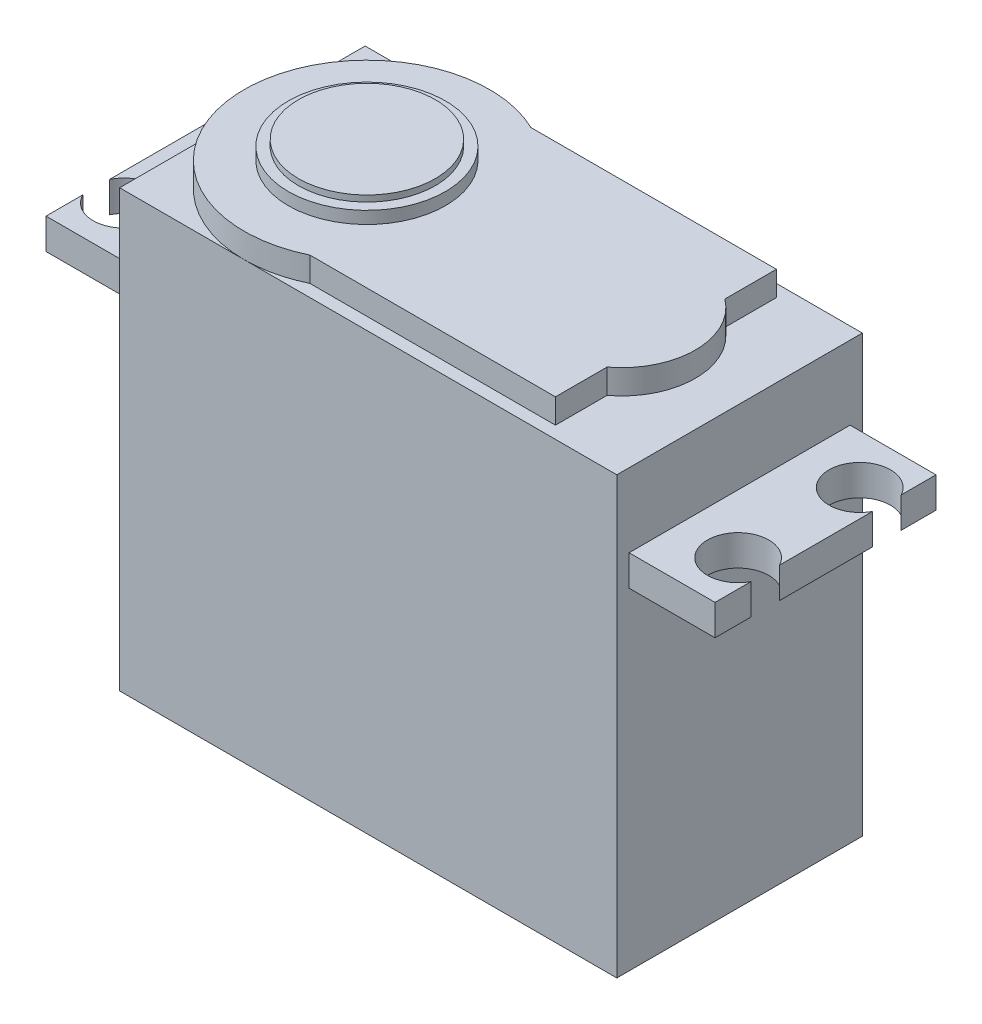
ISO-10303-21;
HEADER;
FILE_DESCRIPTION(('STEP AP214'),'2;1');
FILE_NAME('part.step','',(''),(''),'','','');
FILE_SCHEMA(('AUTOMOTIVE_DESIGN { 1 0 10303 214 1 1 1 1 }'));
ENDSEC;
DATA;
#1=APPLICATION_CONTEXT('core data for automotive mechanical design processes');
#2=APPLICATION_PROTOCOL_DEFINITION('international standard','automotive_design',2000,#1);
#3=PRODUCT_CONTEXT('',#1,'mechanical');
#4=PRODUCT('Part','Part','',(#3));
#5=PRODUCT_RELATED_PRODUCT_CATEGORY('part','',(#4));
#6=PRODUCT_DEFINITION_FORMATION('','',#4);
#7=PRODUCT_DEFINITION_CONTEXT('part definition',#1,'design');
#8=PRODUCT_DEFINITION('design','',#6,#7);
#9=PRODUCT_DEFINITION_SHAPE('','',#8);
#10=(LENGTH_UNIT() NAMED_UNIT(*) SI_UNIT(.MILLI.,.METRE.));
#11=(NAMED_UNIT(*) PLANE_ANGLE_UNIT() SI_UNIT($,.RADIAN.));
#12=(NAMED_UNIT(*) SI_UNIT($,.STERADIAN.) SOLID_ANGLE_UNIT());
#13=UNCERTAINTY_MEASURE_WITH_UNIT(LENGTH_MEASURE(1.E-05),#10,'distance_accuracy_value','');
#14=(GEOMETRIC_REPRESENTATION_CONTEXT(3) GLOBAL_UNCERTAINTY_ASSIGNED_CONTEXT((#13)) GLOBAL_UNIT_ASSIGNED_CONTEXT((#10,
#11,#12)) REPRESENTATION_CONTEXT('',''));
#15=CARTESIAN_POINT('',(0.,0.,0.));
#16=DIRECTION('',(0.,0.,1.));
#17=DIRECTION('',(1.,0.,0.));
#18=AXIS2_PLACEMENT_3D('',#15,#16,#17);
#19=CARTESIAN_POINT('',(27.25,27.,-6.25));
#20=DIRECTION('',(1.,0.,0.));
#21=DIRECTION('',(0.,0.,-1.));
#22=AXIS2_PLACEMENT_3D('',#19,#20,#21);
#23=PLANE('',#22);
#24=DIRECTION('',(0.,1.,0.));
#25=VECTOR('',#24,1.);
#26=CARTESIAN_POINT('',(27.25,26.96,3.74107253444669));
#27=LINE('',#26,#25);
#28=CARTESIAN_POINT('',(27.25,27.,3.74107253444669));
#29=VERTEX_POINT('',#28);
#30=CARTESIAN_POINT('',(27.25,29.5,3.74107253444668));
#31=VERTEX_POINT('',#30);
#32=EDGE_CURVE('E50',#29,#31,#27,.T.);
#33=ORIENTED_EDGE('',*,*,#32,.F.);
#34=DIRECTION('',(0.,0.,-1.));
#35=VECTOR('',#34,1.);
#36=CARTESIAN_POINT('',(27.25,27.,-6.25));
#37=LINE('',#36,#35);
#38=CARTESIAN_POINT('',(27.25,27.,-3.83507253444689));
#39=VERTEX_POINT('',#38);
#40=EDGE_CURVE('E254',#29,#39,#37,.T.);
#41=ORIENTED_EDGE('',*,*,#40,.T.);
#42=DIRECTION('',(0.,1.,0.));
#43=VECTOR('',#42,1.);
#44=CARTESIAN_POINT('',(27.25,26.96,-3.83507253444689));
#45=LINE('',#44,#43);
#46=CARTESIAN_POINT('',(27.25,29.5,-3.83507253444689));
#47=VERTEX_POINT('',#46);
#48=EDGE_CURVE('E319',#39,#47,#45,.T.);
#49=ORIENTED_EDGE('',*,*,#48,.T.);
#50=DIRECTION('',(0.,0.,-1.));
#51=VECTOR('',#50,1.);
#52=CARTESIAN_POINT('',(27.25,29.5,0.));
#53=LINE('',#52,#51);
#54=EDGE_CURVE('E234',#31,#47,#53,.T.);
#55=ORIENTED_EDGE('',*,*,#54,.F.);
#56=EDGE_LOOP('',(#33,#41,#49,#55));
#57=FACE_BOUND('',#56,.T.);
#58=ADVANCED_FACE('F35',(#57),#23,.T.);
#59=DIRECTION('',(0.,1.,0.));
#60=VECTOR('',#59,1.);
#61=CARTESIAN_POINT('',(27.25,26.96,-6.1649274655531));
#62=LINE('',#61,#60);
#63=CARTESIAN_POINT('',(27.25,27.,-6.1649274655531));
#64=VERTEX_POINT('',#63);
#65=CARTESIAN_POINT('',(27.25,29.5,-6.1649274655531));
#66=VERTEX_POINT('',#65);
#67=EDGE_CURVE('E58',#64,#66,#62,.T.);
#68=ORIENTED_EDGE('',*,*,#67,.F.);
#69=CARTESIAN_POINT('',(27.25,27.,-9.));
#70=VERTEX_POINT('',#69);
#71=EDGE_CURVE('E255',#64,#70,#37,.T.);
#72=ORIENTED_EDGE('',*,*,#71,.T.);
#73=DIRECTION('',(0.,1.,0.));
#74=VECTOR('',#73,1.);
#75=CARTESIAN_POINT('',(27.25,27.,-9.));
#76=LINE('',#75,#74);
#77=CARTESIAN_POINT('',(27.25,29.5,-9.));
#78=VERTEX_POINT('',#77);
#79=EDGE_CURVE('E252',#70,#78,#76,.T.);
#80=ORIENTED_EDGE('',*,*,#79,.T.);
#81=EDGE_CURVE('E236',#66,#78,#53,.T.);
#82=ORIENTED_EDGE('',*,*,#81,.F.);
#83=EDGE_LOOP('',(#68,#72,#80,#82));
#84=FACE_BOUND('',#83,.T.);
#85=ADVANCED_FACE('F336',(#84),#23,.T.);
#86=CARTESIAN_POINT('',(-27.25,27.,0.));
#87=DIRECTION('',(1.,0.,0.));
#88=DIRECTION('',(0.,0.,-1.));
#89=AXIS2_PLACEMENT_3D('',#86,#87,#88);
#90=PLANE('',#89);
#91=DIRECTION('',(0.,0.,-1.));
#92=VECTOR('',#91,1.);
#93=CARTESIAN_POINT('',(-27.25,27.,0.));
#94=LINE('',#93,#92);
#95=CARTESIAN_POINT('',(-27.25,27.,3.81627526411505));
#96=VERTEX_POINT('',#95);
#97=CARTESIAN_POINT('',(-27.25,27.,-3.91027526411485));
#98=VERTEX_POINT('',#97);
#99=EDGE_CURVE('E273',#96,#98,#94,.T.);
#100=ORIENTED_EDGE('',*,*,#99,.F.);
#101=DIRECTION('',(0.,1.,0.));
#102=VECTOR('',#101,1.);
#103=CARTESIAN_POINT('',(-27.25,26.96,3.81627526411505));
#104=LINE('',#103,#102);
#105=CARTESIAN_POINT('',(-27.25,29.5,3.81627526411505));
#106=VERTEX_POINT('',#105);
#107=EDGE_CURVE('E307',#96,#106,#104,.T.);
#108=ORIENTED_EDGE('',*,*,#107,.T.);
#109=DIRECTION('',(0.,0.,-1.));
#110=VECTOR('',#109,1.);
#111=CARTESIAN_POINT('',(-27.25,29.5,0.));
#112=LINE('',#111,#110);
#113=CARTESIAN_POINT('',(-27.25,29.5,-3.91027526411485));
#114=VERTEX_POINT('',#113);
#115=EDGE_CURVE('E264',#106,#114,#112,.T.);
#116=ORIENTED_EDGE('',*,*,#115,.T.);
#117=DIRECTION('',(0.,1.,0.));
#118=VECTOR('',#117,1.);
#119=CARTESIAN_POINT('',(-27.25,26.96,-3.91027526411484));
#120=LINE('',#119,#118);
#121=EDGE_CURVE('E301',#114,#98,#120,.F.);
#122=ORIENTED_EDGE('',*,*,#121,.T.);
#123=EDGE_LOOP('',(#100,#108,#116,#122));
#124=FACE_BOUND('',#123,.T.);
#125=ADVANCED_FACE('F490',(#124),#90,.F.);
#126=CARTESIAN_POINT('',(-27.25,27.,-6.08972473588515));
#127=VERTEX_POINT('',#126);
#128=CARTESIAN_POINT('',(-27.25,27.,-9.));
#129=VERTEX_POINT('',#128);
#130=EDGE_CURVE('E274',#127,#129,#94,.T.);
#131=ORIENTED_EDGE('',*,*,#130,.F.);
#132=DIRECTION('',(0.,1.,0.));
#133=VECTOR('',#132,1.);
#134=CARTESIAN_POINT('',(-27.25,26.96,-6.08972473588515));
#135=LINE('',#134,#133);
#136=CARTESIAN_POINT('',(-27.25,29.5,-6.08972473588515));
#137=VERTEX_POINT('',#136);
#138=EDGE_CURVE('E296',#127,#137,#135,.T.);
#139=ORIENTED_EDGE('',*,*,#138,.T.);
#140=CARTESIAN_POINT('',(-27.25,29.5,-9.));
#141=VERTEX_POINT('',#140);
#142=EDGE_CURVE('E265',#137,#141,#112,.T.);
#143=ORIENTED_EDGE('',*,*,#142,.T.);
#144=DIRECTION('',(0.,1.,0.));
#145=VECTOR('',#144,1.);
#146=CARTESIAN_POINT('',(-27.25,27.,-9.));
#147=LINE('',#146,#145);
#148=EDGE_CURVE('E243',#129,#141,#147,.T.);
#149=ORIENTED_EDGE('',*,*,#148,.F.);
#150=EDGE_LOOP('',(#131,#139,#143,#149));
#151=FACE_BOUND('',#150,.T.);
#152=ADVANCED_FACE('F518',(#151),#90,.F.);
#153=CARTESIAN_POINT('',(-20.25,35.5,10.));
#154=DIRECTION('',(1.,0.,0.));
#155=DIRECTION('',(0.,0.,-1.));
#156=AXIS2_PLACEMENT_3D('',#153,#154,#155);
#157=PLANE('',#156);
#158=DIRECTION('',(0.,0.,1.));
#159=VECTOR('',#158,1.);
#160=CARTESIAN_POINT('',(-20.25,0.,10.));
#161=LINE('',#160,#159);
#162=CARTESIAN_POINT('',(-20.25,0.,-10.));
#163=VERTEX_POINT('',#162);
#164=CARTESIAN_POINT('',(-20.25,0.,10.));
#165=VERTEX_POINT('',#164);
#166=EDGE_CURVE('E409',#163,#165,#161,.T.);
#167=ORIENTED_EDGE('',*,*,#166,.T.);
#168=DIRECTION('',(0.,-1.,0.));
#169=VECTOR('',#168,1.);
#170=CARTESIAN_POINT('',(-20.25,35.5,10.));
#171=LINE('',#170,#169);
#172=CARTESIAN_POINT('',(-20.25,35.5,10.));
#173=VERTEX_POINT('',#172);
#174=EDGE_CURVE('E440',#173,#165,#171,.T.);
#175=ORIENTED_EDGE('',*,*,#174,.F.);
#176=DIRECTION('',(0.,0.,1.));
#177=VECTOR('',#176,1.);
#178=CARTESIAN_POINT('',(-20.25,35.5,10.));
#179=LINE('',#178,#177);
#180=CARTESIAN_POINT('',(-20.25,35.5,-10.));
#181=VERTEX_POINT('',#180);
#182=EDGE_CURVE('E410',#181,#173,#179,.T.);
#183=ORIENTED_EDGE('',*,*,#182,.F.);
#184=DIRECTION('',(0.,-1.,0.));
#185=VECTOR('',#184,1.);
#186=CARTESIAN_POINT('',(-20.25,35.5,-10.));
#187=LINE('',#186,#185);
#188=EDGE_CURVE('E424',#181,#163,#187,.T.);
#189=ORIENTED_EDGE('',*,*,#188,.T.);
#190=EDGE_LOOP('',(#167,#175,#183,#189));
#191=FACE_BOUND('',#190,.T.);
#192=DIRECTION('',(0.,1.,0.));
#193=VECTOR('',#192,1.);
#194=CARTESIAN_POINT('',(-20.25,27.,9.));
#195=LINE('',#194,#193);
#196=CARTESIAN_POINT('',(-20.25,27.,9.));
#197=VERTEX_POINT('',#196);
#198=CARTESIAN_POINT('',(-20.25,29.5,9.));
#199=VERTEX_POINT('',#198);
#200=EDGE_CURVE('E284',#197,#199,#195,.T.);
#201=ORIENTED_EDGE('',*,*,#200,.F.);
#202=DIRECTION('',(0.,0.,1.));
#203=VECTOR('',#202,1.);
#204=CARTESIAN_POINT('',(-20.25,27.,0.));
#205=LINE('',#204,#203);
#206=CARTESIAN_POINT('',(-20.25,27.,-9.));
#207=VERTEX_POINT('',#206);
#208=EDGE_CURVE('E263',#207,#197,#205,.T.);
#209=ORIENTED_EDGE('',*,*,#208,.F.);
#210=DIRECTION('',(0.,1.,0.));
#211=VECTOR('',#210,1.);
#212=CARTESIAN_POINT('',(-20.25,27.,-9.));
#213=LINE('',#212,#211);
#214=CARTESIAN_POINT('',(-20.25,29.5,-9.));
#215=VERTEX_POINT('',#214);
#216=EDGE_CURVE('E246',#207,#215,#213,.T.);
#217=ORIENTED_EDGE('',*,*,#216,.T.);
#218=DIRECTION('',(0.,0.,1.));
#219=VECTOR('',#218,1.);
#220=CARTESIAN_POINT('',(-20.25,29.5,0.));
#221=LINE('',#220,#219);
#222=EDGE_CURVE('E268',#215,#199,#221,.T.);
#223=ORIENTED_EDGE('',*,*,#222,.T.);
#224=EDGE_LOOP('',(#201,#209,#217,#223));
#225=FACE_BOUND('',#224,.T.);
#226=ADVANCED_FACE('F37',(#191,#225),#157,.F.);
#227=CARTESIAN_POINT('',(20.25,35.5,10.));
#228=DIRECTION('',(-1.,0.,0.));
#229=DIRECTION('',(0.,0.,1.));
#230=AXIS2_PLACEMENT_3D('',#227,#228,#229);
#231=PLANE('',#230);
#232=DIRECTION('',(0.,0.,-1.));
#233=VECTOR('',#232,1.);
#234=CARTESIAN_POINT('',(20.25,0.,10.));
#235=LINE('',#234,#233);
#236=CARTESIAN_POINT('',(20.25,0.,10.));
#237=VERTEX_POINT('',#236);
#238=CARTESIAN_POINT('',(20.25,0.,-10.));
#239=VERTEX_POINT('',#238);
#240=EDGE_CURVE('E429',#237,#239,#235,.T.);
#241=ORIENTED_EDGE('',*,*,#240,.T.);
#242=DIRECTION('',(0.,-1.,0.));
#243=VECTOR('',#242,1.);
#244=CARTESIAN_POINT('',(20.25,35.5,-10.));
#245=LINE('',#244,#243);
#246=CARTESIAN_POINT('',(20.25,35.5,-10.));
#247=VERTEX_POINT('',#246);
#248=EDGE_CURVE('E434',#247,#239,#245,.T.);
#249=ORIENTED_EDGE('',*,*,#248,.F.);
#250=DIRECTION('',(0.,0.,-1.));
#251=VECTOR('',#250,1.);
#252=CARTESIAN_POINT('',(20.25,35.5,10.));
#253=LINE('',#252,#251);
#254=CARTESIAN_POINT('',(20.25,35.5,10.));
#255=VERTEX_POINT('',#254);
#256=EDGE_CURVE('E418',#255,#247,#253,.T.);
#257=ORIENTED_EDGE('',*,*,#256,.F.);
#258=DIRECTION('',(0.,-1.,0.));
#259=VECTOR('',#258,1.);
#260=CARTESIAN_POINT('',(20.25,35.5,10.));
#261=LINE('',#260,#259);
#262=EDGE_CURVE('E437',#255,#237,#261,.T.);
#263=ORIENTED_EDGE('',*,*,#262,.T.);
#264=EDGE_LOOP('',(#241,#249,#257,#263));
#265=FACE_BOUND('',#264,.T.);
#266=DIRECTION('',(0.,0.,1.));
#267=VECTOR('',#266,1.);
#268=CARTESIAN_POINT('',(20.25,27.,0.));
#269=LINE('',#268,#267);
#270=CARTESIAN_POINT('',(20.25,27.,-9.));
#271=VERTEX_POINT('',#270);
#272=CARTESIAN_POINT('',(20.25,27.,9.));
#273=VERTEX_POINT('',#272);
#274=EDGE_CURVE('E237',#271,#273,#269,.T.);
#275=ORIENTED_EDGE('',*,*,#274,.T.);
#276=DIRECTION('',(0.,1.,0.));
#277=VECTOR('',#276,1.);
#278=CARTESIAN_POINT('',(20.25,27.,9.));
#279=LINE('',#278,#277);
#280=CARTESIAN_POINT('',(20.25,29.5,9.));
#281=VERTEX_POINT('',#280);
#282=EDGE_CURVE('E278',#273,#281,#279,.T.);
#283=ORIENTED_EDGE('',*,*,#282,.T.);
#284=DIRECTION('',(0.,0.,1.));
#285=VECTOR('',#284,1.);
#286=CARTESIAN_POINT('',(20.25,29.5,0.));
#287=LINE('',#286,#285);
#288=CARTESIAN_POINT('',(20.25,29.5,-9.));
#289=VERTEX_POINT('',#288);
#290=EDGE_CURVE('E240',#289,#281,#287,.T.);
#291=ORIENTED_EDGE('',*,*,#290,.F.);
#292=DIRECTION('',(0.,1.,0.));
#293=VECTOR('',#292,1.);
#294=CARTESIAN_POINT('',(20.25,27.,-9.));
#295=LINE('',#294,#293);
#296=EDGE_CURVE('E342',#271,#289,#295,.T.);
#297=ORIENTED_EDGE('',*,*,#296,.F.);
#298=EDGE_LOOP('',(#275,#283,#291,#297));
#299=FACE_BOUND('',#298,.T.);
#300=ADVANCED_FACE('F704',(#265,#299),#231,.F.);
#301=CARTESIAN_POINT('',(-10.1088989435407,38.5,0.));
#302=DIRECTION('',(0.,1.,0.));
#303=DIRECTION('',(0.,0.,1.));
#304=AXIS2_PLACEMENT_3D('',#301,#302,#303);
#305=PLANE('',#304);
#306=CARTESIAN_POINT('',(-10.1088989435407,38.5,0.));
#307=DIRECTION('',(0.,1.,0.));
#308=DIRECTION('',(0.,0.,1.));
#309=AXIS2_PLACEMENT_3D('',#306,#307,#308);
#310=CIRCLE('',#309,6.4);
#311=CARTESIAN_POINT('',(-10.1088989435407,38.5,6.40000000000001));
#312=VERTEX_POINT('',#311);
#313=EDGE_CURVE('E353',#312,#312,#310,.T.);
#314=ORIENTED_EDGE('',*,*,#313,.T.);
#315=EDGE_LOOP('',(#314));
#316=FACE_BOUND('',#315,.T.);
#317=CARTESIAN_POINT('',(-10.1088989435407,38.5,0.));
#318=DIRECTION('',(0.,1.,0.));
#319=DIRECTION('',(0.,0.,1.));
#320=AXIS2_PLACEMENT_3D('',#317,#318,#319);
#321=CIRCLE('',#320,5.575);
#322=CARTESIAN_POINT('',(-10.1088989435407,38.5,5.57500000000001));
#323=VERTEX_POINT('',#322);
#324=EDGE_CURVE('E344',#323,#323,#321,.T.);
#325=ORIENTED_EDGE('',*,*,#324,.F.);
#326=EDGE_LOOP('',(#325));
#327=FACE_BOUND('',#326,.T.);
#328=ADVANCED_FACE('F688',(#316,#327),#305,.T.);
#329=CARTESIAN_POINT('',(-10.1088989435407,37.5,0.));
#330=DIRECTION('',(0.,1.,0.));
#331=DIRECTION('',(0.,0.,1.));
#332=AXIS2_PLACEMENT_3D('',#329,#330,#331);
#333=PLANE('',#332);
#334=CARTESIAN_POINT('',(-10.1088989435407,37.5,0.));
#335=DIRECTION('',(0.,1.,0.));
#336=DIRECTION('',(0.,0.,1.));
#337=AXIS2_PLACEMENT_3D('',#334,#335,#336);
#338=CIRCLE('',#337,10.);
#339=CARTESIAN_POINT('',(-5.75,37.5,-9.));
#340=VERTEX_POINT('',#339);
#341=CARTESIAN_POINT('',(-5.75,37.5,9.));
#342=VERTEX_POINT('',#341);
#343=EDGE_CURVE('E359',#340,#342,#338,.T.);
#344=ORIENTED_EDGE('',*,*,#343,.T.);
#345=DIRECTION('',(1.,0.,0.));
#346=VECTOR('',#345,1.);
#347=CARTESIAN_POINT('',(-5.75,37.5,9.));
#348=LINE('',#347,#346);
#349=CARTESIAN_POINT('',(14.25,37.5,9.));
#350=VERTEX_POINT('',#349);
#351=EDGE_CURVE('E362',#342,#350,#348,.T.);
#352=ORIENTED_EDGE('',*,*,#351,.T.);
#353=DIRECTION('',(0.,0.,-1.));
#354=VECTOR('',#353,1.);
#355=CARTESIAN_POINT('',(14.25,37.5,9.));
#356=LINE('',#355,#354);
#357=CARTESIAN_POINT('',(14.25,37.5,4.8));
#358=VERTEX_POINT('',#357);
#359=EDGE_CURVE('E365',#350,#358,#356,.T.);
#360=ORIENTED_EDGE('',*,*,#359,.T.);
#361=CARTESIAN_POINT('',(10.65,37.5,0.));
#362=DIRECTION('',(0.,1.,0.));
#363=DIRECTION('',(0.,0.,-1.));
#364=AXIS2_PLACEMENT_3D('',#361,#362,#363);
#365=CIRCLE('',#364,6.);
#366=CARTESIAN_POINT('',(14.25,37.5,-4.8));
#367=VERTEX_POINT('',#366);
#368=EDGE_CURVE('E367',#358,#367,#365,.T.);
#369=ORIENTED_EDGE('',*,*,#368,.T.);
#370=DIRECTION('',(0.,0.,-1.));
#371=VECTOR('',#370,1.);
#372=CARTESIAN_POINT('',(14.25,37.5,-9.));
#373=LINE('',#372,#371);
#374=CARTESIAN_POINT('',(14.25,37.5,-9.));
#375=VERTEX_POINT('',#374);
#376=EDGE_CURVE('E369',#367,#375,#373,.T.);
#377=ORIENTED_EDGE('',*,*,#376,.T.);
#378=DIRECTION('',(-1.,0.,0.));
#379=VECTOR('',#378,1.);
#380=CARTESIAN_POINT('',(-5.75,37.5,-9.));
#381=LINE('',#380,#379);
#382=EDGE_CURVE('E371',#375,#340,#381,.T.);
#383=ORIENTED_EDGE('',*,*,#382,.T.);
#384=EDGE_LOOP('',(#344,#352,#360,#369,#377,#383));
#385=FACE_BOUND('',#384,.T.);
#386=CARTESIAN_POINT('',(-10.1088989435407,37.5,0.));
#387=DIRECTION('',(0.,1.,0.));
#388=DIRECTION('',(0.,0.,1.));
#389=AXIS2_PLACEMENT_3D('',#386,#387,#388);
#390=CIRCLE('',#389,6.4);
#391=CARTESIAN_POINT('',(-10.1088989435407,37.5,6.40000000000001));
#392=VERTEX_POINT('',#391);
#393=EDGE_CURVE('E350',#392,#392,#390,.T.);
#394=ORIENTED_EDGE('',*,*,#393,.F.);
#395=EDGE_LOOP('',(#394));
#396=FACE_BOUND('',#395,.T.);
#397=ADVANCED_FACE('F458',(#385,#396),#333,.T.);
#398=CARTESIAN_POINT('',(0.,35.5,0.));
#399=DIRECTION('',(0.,-1.,0.));
#400=DIRECTION('',(0.,0.,-1.));
#401=AXIS2_PLACEMENT_3D('',#398,#399,#400);
#402=PLANE('',#401);
#403=CARTESIAN_POINT('',(-10.1088989435407,35.5,0.));
#404=DIRECTION('',(0.,1.,0.));
#405=DIRECTION('',(0.,0.,1.));
#406=AXIS2_PLACEMENT_3D('',#403,#404,#405);
#407=CIRCLE('',#406,10.);
#408=CARTESIAN_POINT('',(-5.75,35.5,-9.));
#409=VERTEX_POINT('',#408);
#410=CARTESIAN_POINT('',(-10.1088989435407,35.5,-10.));
#411=VERTEX_POINT('',#410);
#412=EDGE_CURVE('E356',#409,#411,#407,.T.);
#413=ORIENTED_EDGE('',*,*,#412,.F.);
#414=DIRECTION('',(-1.,0.,0.));
#415=VECTOR('',#414,1.);
#416=CARTESIAN_POINT('',(-5.75,35.5,-9.));
#417=LINE('',#416,#415);
#418=CARTESIAN_POINT('',(14.25,35.5,-9.));
#419=VERTEX_POINT('',#418);
#420=EDGE_CURVE('E363',#419,#409,#417,.T.);
#421=ORIENTED_EDGE('',*,*,#420,.F.);
#422=DIRECTION('',(0.,0.,-1.));
#423=VECTOR('',#422,1.);
#424=CARTESIAN_POINT('',(14.25,35.5,-9.));
#425=LINE('',#424,#423);
#426=CARTESIAN_POINT('',(14.25,35.5,-4.8));
#427=VERTEX_POINT('',#426);
#428=EDGE_CURVE('E387',#427,#419,#425,.T.);
#429=ORIENTED_EDGE('',*,*,#428,.F.);
#430=CARTESIAN_POINT('',(10.65,35.5,0.));
#431=DIRECTION('',(0.,1.,0.));
#432=DIRECTION('',(0.,0.,-1.));
#433=AXIS2_PLACEMENT_3D('',#430,#431,#432);
#434=CIRCLE('',#433,6.);
#435=CARTESIAN_POINT('',(14.25,35.5,4.8));
#436=VERTEX_POINT('',#435);
#437=EDGE_CURVE('E384',#436,#427,#434,.T.);
#438=ORIENTED_EDGE('',*,*,#437,.F.);
#439=DIRECTION('',(0.,0.,-1.));
#440=VECTOR('',#439,1.);
#441=CARTESIAN_POINT('',(14.25,35.5,9.));
#442=LINE('',#441,#440);
#443=CARTESIAN_POINT('',(14.25,35.5,9.));
#444=VERTEX_POINT('',#443);
#445=EDGE_CURVE('E381',#444,#436,#442,.T.);
#446=ORIENTED_EDGE('',*,*,#445,.F.);
#447=DIRECTION('',(1.,0.,0.));
#448=VECTOR('',#447,1.);
#449=CARTESIAN_POINT('',(-5.75,35.5,9.));
#450=LINE('',#449,#448);
#451=CARTESIAN_POINT('',(-5.75,35.5,9.));
#452=VERTEX_POINT('',#451);
#453=EDGE_CURVE('E376',#452,#444,#450,.T.);
#454=ORIENTED_EDGE('',*,*,#453,.F.);
#455=CARTESIAN_POINT('',(-10.1088989435407,35.5,10.));
#456=VERTEX_POINT('',#455);
#457=EDGE_CURVE('E378',#456,#452,#407,.T.);
#458=ORIENTED_EDGE('',*,*,#457,.F.);
#459=DIRECTION('',(1.,0.,0.));
#460=VECTOR('',#459,1.);
#461=CARTESIAN_POINT('',(-20.25,35.5,10.));
#462=LINE('',#461,#460);
#463=EDGE_CURVE('E413',#456,#255,#462,.T.);
#464=ORIENTED_EDGE('',*,*,#463,.T.);
#465=ORIENTED_EDGE('',*,*,#256,.T.);
#466=DIRECTION('',(-1.,0.,0.));
#467=VECTOR('',#466,1.);
#468=CARTESIAN_POINT('',(-20.25,35.5,-10.));
#469=LINE('',#468,#467);
#470=EDGE_CURVE('E421',#247,#411,#469,.T.);
#471=ORIENTED_EDGE('',*,*,#470,.T.);
#472=EDGE_LOOP('',(#413,#421,#429,#438,#446,#454,#458,#464,#465,#471));
#473=FACE_BOUND('',#472,.T.);
#474=ADVANCED_FACE('F465',(#473),#402,.F.);
#475=EDGE_CURVE('E377',#411,#456,#407,.T.);
#476=ORIENTED_EDGE('',*,*,#475,.F.);
#477=EDGE_CURVE('E420',#411,#181,#469,.T.);
#478=ORIENTED_EDGE('',*,*,#477,.T.);
#479=ORIENTED_EDGE('',*,*,#182,.T.);
#480=EDGE_CURVE('E415',#173,#456,#462,.T.);
#481=ORIENTED_EDGE('',*,*,#480,.T.);
#482=EDGE_LOOP('',(#476,#478,#479,#481));
#483=FACE_BOUND('',#482,.T.);
#484=ADVANCED_FACE('F626',(#483),#402,.F.);
#485=CARTESIAN_POINT('',(-20.25,35.5,10.));
#486=DIRECTION('',(0.,0.,-1.));
#487=DIRECTION('',(-1.,0.,0.));
#488=AXIS2_PLACEMENT_3D('',#485,#486,#487);
#489=PLANE('',#488);
#490=DIRECTION('',(1.,0.,0.));
#491=VECTOR('',#490,1.);
#492=CARTESIAN_POINT('',(-20.25,0.,10.));
#493=LINE('',#492,#491);
#494=EDGE_CURVE('E427',#165,#237,#493,.T.);
#495=ORIENTED_EDGE('',*,*,#494,.T.);
#496=ORIENTED_EDGE('',*,*,#262,.F.);
#497=ORIENTED_EDGE('',*,*,#463,.F.);
#498=ORIENTED_EDGE('',*,*,#480,.F.);
#499=ORIENTED_EDGE('',*,*,#174,.T.);
#500=EDGE_LOOP('',(#495,#496,#497,#498,#499));
#501=FACE_BOUND('',#500,.T.);
#502=ADVANCED_FACE('F621',(#501),#489,.F.);
#503=CARTESIAN_POINT('',(-20.25,35.5,-10.));
#504=DIRECTION('',(0.,0.,1.));
#505=DIRECTION('',(1.,0.,0.));
#506=AXIS2_PLACEMENT_3D('',#503,#504,#505);
#507=PLANE('',#506);
#508=DIRECTION('',(-1.,0.,0.));
#509=VECTOR('',#508,1.);
#510=CARTESIAN_POINT('',(-20.25,0.,-10.));
#511=LINE('',#510,#509);
#512=EDGE_CURVE('E414',#239,#163,#511,.T.);
#513=ORIENTED_EDGE('',*,*,#512,.T.);
#514=ORIENTED_EDGE('',*,*,#188,.F.);
#515=ORIENTED_EDGE('',*,*,#477,.F.);
#516=ORIENTED_EDGE('',*,*,#470,.F.);
#517=ORIENTED_EDGE('',*,*,#248,.T.);
#518=EDGE_LOOP('',(#513,#514,#515,#516,#517));
#519=FACE_BOUND('',#518,.T.);
#520=ADVANCED_FACE('F625',(#519),#507,.F.);
#521=CARTESIAN_POINT('',(0.,0.,0.));
#522=DIRECTION('',(0.,-1.,0.));
#523=DIRECTION('',(0.,0.,-1.));
#524=AXIS2_PLACEMENT_3D('',#521,#522,#523);
#525=PLANE('',#524);
#526=ORIENTED_EDGE('',*,*,#166,.F.);
#527=ORIENTED_EDGE('',*,*,#512,.F.);
#528=ORIENTED_EDGE('',*,*,#240,.F.);
#529=ORIENTED_EDGE('',*,*,#494,.F.);
#530=EDGE_LOOP('',(#526,#527,#528,#529));
#531=FACE_BOUND('',#530,.T.);
#532=ADVANCED_FACE('F635',(#531),#525,.T.);
#533=CARTESIAN_POINT('',(-10.1088989435407,37.5,0.));
#534=DIRECTION('',(0.,-1.,0.));
#535=DIRECTION('',(0.,0.,-1.));
#536=AXIS2_PLACEMENT_3D('',#533,#534,#535);
#537=CYLINDRICAL_SURFACE('',#536,10.);
#538=ORIENTED_EDGE('',*,*,#412,.T.);
#539=ORIENTED_EDGE('',*,*,#475,.T.);
#540=ORIENTED_EDGE('',*,*,#457,.T.);
#541=DIRECTION('',(0.,-1.,0.));
#542=VECTOR('',#541,1.);
#543=CARTESIAN_POINT('',(-5.75,37.5,9.));
#544=LINE('',#543,#542);
#545=EDGE_CURVE('E406',#342,#452,#544,.T.);
#546=ORIENTED_EDGE('',*,*,#545,.F.);
#547=ORIENTED_EDGE('',*,*,#343,.F.);
#548=DIRECTION('',(0.,-1.,0.));
#549=VECTOR('',#548,1.);
#550=CARTESIAN_POINT('',(-5.75,37.5,-9.));
#551=LINE('',#550,#549);
#552=EDGE_CURVE('E373',#340,#409,#551,.T.);
#553=ORIENTED_EDGE('',*,*,#552,.T.);
#554=EDGE_LOOP('',(#538,#539,#540,#546,#547,#553));
#555=FACE_BOUND('',#554,.T.);
#556=ADVANCED_FACE('F449',(#555),#537,.T.);
#557=CARTESIAN_POINT('',(-5.75,37.5,9.));
#558=DIRECTION('',(0.,0.,-1.));
#559=DIRECTION('',(-1.,0.,0.));
#560=AXIS2_PLACEMENT_3D('',#557,#558,#559);
#561=PLANE('',#560);
#562=ORIENTED_EDGE('',*,*,#453,.T.);
#563=DIRECTION('',(0.,-1.,0.));
#564=VECTOR('',#563,1.);
#565=CARTESIAN_POINT('',(14.25,37.5,9.));
#566=LINE('',#565,#564);
#567=EDGE_CURVE('E403',#350,#444,#566,.T.);
#568=ORIENTED_EDGE('',*,*,#567,.F.);
#569=ORIENTED_EDGE('',*,*,#351,.F.);
#570=ORIENTED_EDGE('',*,*,#545,.T.);
#571=EDGE_LOOP('',(#562,#568,#569,#570));
#572=FACE_BOUND('',#571,.T.);
#573=ADVANCED_FACE('F454',(#572),#561,.F.);
#574=CARTESIAN_POINT('',(14.25,37.5,9.));
#575=DIRECTION('',(-1.,0.,0.));
#576=DIRECTION('',(0.,0.,1.));
#577=AXIS2_PLACEMENT_3D('',#574,#575,#576);
#578=PLANE('',#577);
#579=ORIENTED_EDGE('',*,*,#445,.T.);
#580=DIRECTION('',(0.,-1.,0.));
#581=VECTOR('',#580,1.);
#582=CARTESIAN_POINT('',(14.25,37.5,4.8));
#583=LINE('',#582,#581);
#584=EDGE_CURVE('E400',#358,#436,#583,.T.);
#585=ORIENTED_EDGE('',*,*,#584,.F.);
#586=ORIENTED_EDGE('',*,*,#359,.F.);
#587=ORIENTED_EDGE('',*,*,#567,.T.);
#588=EDGE_LOOP('',(#579,#585,#586,#587));
#589=FACE_BOUND('',#588,.T.);
#590=ADVANCED_FACE('F475',(#589),#578,.F.);
#591=CARTESIAN_POINT('',(10.65,37.5,0.));
#592=DIRECTION('',(0.,-1.,0.));
#593=DIRECTION('',(0.,0.,-1.));
#594=AXIS2_PLACEMENT_3D('',#591,#592,#593);
#595=CYLINDRICAL_SURFACE('',#594,6.);
#596=ORIENTED_EDGE('',*,*,#437,.T.);
#597=DIRECTION('',(0.,-1.,0.));
#598=VECTOR('',#597,1.);
#599=CARTESIAN_POINT('',(14.25,37.5,-4.8));
#600=LINE('',#599,#598);
#601=EDGE_CURVE('E397',#367,#427,#600,.T.);
#602=ORIENTED_EDGE('',*,*,#601,.F.);
#603=ORIENTED_EDGE('',*,*,#368,.F.);
#604=ORIENTED_EDGE('',*,*,#584,.T.);
#605=EDGE_LOOP('',(#596,#602,#603,#604));
#606=FACE_BOUND('',#605,.T.);
#607=ADVANCED_FACE('F472',(#606),#595,.T.);
#608=CARTESIAN_POINT('',(14.25,37.5,-9.));
#609=DIRECTION('',(-1.,0.,0.));
#610=DIRECTION('',(0.,0.,1.));
#611=AXIS2_PLACEMENT_3D('',#608,#609,#610);
#612=PLANE('',#611);
#613=ORIENTED_EDGE('',*,*,#428,.T.);
#614=DIRECTION('',(0.,-1.,0.));
#615=VECTOR('',#614,1.);
#616=CARTESIAN_POINT('',(14.25,37.5,-9.));
#617=LINE('',#616,#615);
#618=EDGE_CURVE('E394',#375,#419,#617,.T.);
#619=ORIENTED_EDGE('',*,*,#618,.F.);
#620=ORIENTED_EDGE('',*,*,#376,.F.);
#621=ORIENTED_EDGE('',*,*,#601,.T.);
#622=EDGE_LOOP('',(#613,#619,#620,#621));
#623=FACE_BOUND('',#622,.T.);
#624=ADVANCED_FACE('F467',(#623),#612,.F.);
#625=CARTESIAN_POINT('',(-5.75,37.5,-9.));
#626=DIRECTION('',(0.,0.,1.));
#627=DIRECTION('',(1.,0.,0.));
#628=AXIS2_PLACEMENT_3D('',#625,#626,#627);
#629=PLANE('',#628);
#630=ORIENTED_EDGE('',*,*,#420,.T.);
#631=ORIENTED_EDGE('',*,*,#552,.F.);
#632=ORIENTED_EDGE('',*,*,#382,.F.);
#633=ORIENTED_EDGE('',*,*,#618,.T.);
#634=EDGE_LOOP('',(#630,#631,#632,#633));
#635=FACE_BOUND('',#634,.T.);
#636=ADVANCED_FACE('F463',(#635),#629,.F.);
#637=CARTESIAN_POINT('',(-10.1088989435407,38.5,0.));
#638=DIRECTION('',(0.,-1.,0.));
#639=DIRECTION('',(0.,0.,-1.));
#640=AXIS2_PLACEMENT_3D('',#637,#638,#639);
#641=CYLINDRICAL_SURFACE('',#640,6.4);
#642=ORIENTED_EDGE('',*,*,#313,.F.);
#643=EDGE_LOOP('',(#642));
#644=FACE_BOUND('',#643,.T.);
#645=ORIENTED_EDGE('',*,*,#393,.T.);
#646=EDGE_LOOP('',(#645));
#647=FACE_BOUND('',#646,.T.);
#648=ADVANCED_FACE('F680',(#644,#647),#641,.T.);
#649=CARTESIAN_POINT('',(-10.1088989435407,39.,0.));
#650=DIRECTION('',(0.,-1.,0.));
#651=DIRECTION('',(0.,0.,-1.));
#652=AXIS2_PLACEMENT_3D('',#649,#650,#651);
#653=CYLINDRICAL_SURFACE('',#652,5.575);
#654=CARTESIAN_POINT('',(-10.1088989435407,39.,0.));
#655=DIRECTION('',(0.,1.,0.));
#656=DIRECTION('',(0.,0.,1.));
#657=AXIS2_PLACEMENT_3D('',#654,#655,#656);
#658=CIRCLE('',#657,5.575);
#659=CARTESIAN_POINT('',(-10.1088989435407,39.,5.57500000000001));
#660=VERTEX_POINT('',#659);
#661=EDGE_CURVE('E347',#660,#660,#658,.T.);
#662=ORIENTED_EDGE('',*,*,#661,.F.);
#663=EDGE_LOOP('',(#662));
#664=FACE_BOUND('',#663,.T.);
#665=ORIENTED_EDGE('',*,*,#324,.T.);
#666=EDGE_LOOP('',(#665));
#667=FACE_BOUND('',#666,.T.);
#668=ADVANCED_FACE('F505',(#664,#667),#653,.T.);
#669=CARTESIAN_POINT('',(-10.1088989435407,39.,0.));
#670=DIRECTION('',(0.,1.,0.));
#671=DIRECTION('',(0.,0.,1.));
#672=AXIS2_PLACEMENT_3D('',#669,#670,#671);
#673=PLANE('',#672);
#674=ORIENTED_EDGE('',*,*,#661,.T.);
#675=EDGE_LOOP('',(#674));
#676=FACE_BOUND('',#675,.T.);
#677=ADVANCED_FACE('F500',(#676),#673,.T.);
#678=CARTESIAN_POINT('',(20.25,27.,-9.));
#679=DIRECTION('',(0.,0.,-1.));
#680=DIRECTION('',(-1.,0.,0.));
#681=AXIS2_PLACEMENT_3D('',#678,#679,#680);
#682=PLANE('',#681);
#683=DIRECTION('',(-1.,0.,0.));
#684=VECTOR('',#683,1.);
#685=CARTESIAN_POINT('',(20.25,29.5,-9.));
#686=LINE('',#685,#684);
#687=EDGE_CURVE('E233',#78,#289,#686,.T.);
#688=ORIENTED_EDGE('',*,*,#687,.F.);
#689=ORIENTED_EDGE('',*,*,#79,.F.);
#690=DIRECTION('',(-1.,0.,0.));
#691=VECTOR('',#690,1.);
#692=CARTESIAN_POINT('',(20.25,27.,-9.));
#693=LINE('',#692,#691);
#694=EDGE_CURVE('E249',#70,#271,#693,.T.);
#695=ORIENTED_EDGE('',*,*,#694,.T.);
#696=ORIENTED_EDGE('',*,*,#296,.T.);
#697=EDGE_LOOP('',(#688,#689,#695,#696));
#698=FACE_BOUND('',#697,.T.);
#699=ADVANCED_FACE('F339',(#698),#682,.T.);
#700=DIRECTION('',(0.,1.,0.));
#701=VECTOR('',#700,1.);
#702=CARTESIAN_POINT('',(27.25,26.96,6.07092746555332));
#703=LINE('',#702,#701);
#704=CARTESIAN_POINT('',(27.25,27.,6.07092746555332));
#705=VERTEX_POINT('',#704);
#706=CARTESIAN_POINT('',(27.25,29.5,6.07092746555332));
#707=VERTEX_POINT('',#706);
#708=EDGE_CURVE('E214',#705,#707,#703,.T.);
#709=ORIENTED_EDGE('',*,*,#708,.T.);
#710=CARTESIAN_POINT('',(27.25,29.5,9.));
#711=VERTEX_POINT('',#710);
#712=EDGE_CURVE('E224',#711,#707,#53,.T.);
#713=ORIENTED_EDGE('',*,*,#712,.F.);
#714=DIRECTION('',(0.,1.,0.));
#715=VECTOR('',#714,1.);
#716=CARTESIAN_POINT('',(27.25,27.,9.));
#717=LINE('',#716,#715);
#718=CARTESIAN_POINT('',(27.25,27.,9.));
#719=VERTEX_POINT('',#718);
#720=EDGE_CURVE('E270',#719,#711,#717,.T.);
#721=ORIENTED_EDGE('',*,*,#720,.F.);
#722=EDGE_CURVE('E226',#719,#705,#37,.T.);
#723=ORIENTED_EDGE('',*,*,#722,.T.);
#724=EDGE_LOOP('',(#709,#713,#721,#723));
#725=FACE_BOUND('',#724,.T.);
#726=ADVANCED_FACE('F222',(#725),#23,.T.);
#727=CARTESIAN_POINT('',(24.5,27.,-4.75));
#728=DIRECTION('',(0.,1.,0.));
#729=DIRECTION('',(0.,0.,1.));
#730=AXIS2_PLACEMENT_3D('',#727,#728,#729);
#731=PLANE('',#730);
#732=ORIENTED_EDGE('',*,*,#40,.F.);
#733=CARTESIAN_POINT('',(25.0380000000001,27.,4.906));
#734=DIRECTION('',(0.,1.,0.));
#735=DIRECTION('',(0.,0.,1.));
#736=AXIS2_PLACEMENT_3D('',#733,#734,#735);
#737=CIRCLE('',#736,2.5);
#738=EDGE_CURVE('E227',#29,#705,#737,.T.);
#739=ORIENTED_EDGE('',*,*,#738,.T.);
#740=ORIENTED_EDGE('',*,*,#722,.F.);
#741=DIRECTION('',(-1.,0.,0.));
#742=VECTOR('',#741,1.);
#743=CARTESIAN_POINT('',(20.25,27.,9.));
#744=LINE('',#743,#742);
#745=EDGE_CURVE('E281',#719,#273,#744,.T.);
#746=ORIENTED_EDGE('',*,*,#745,.T.);
#747=ORIENTED_EDGE('',*,*,#274,.F.);
#748=ORIENTED_EDGE('',*,*,#694,.F.);
#749=ORIENTED_EDGE('',*,*,#71,.F.);
#750=CARTESIAN_POINT('',(25.038,27.,-5.));
#751=DIRECTION('',(0.,1.,0.));
#752=DIRECTION('',(0.,0.,1.));
#753=AXIS2_PLACEMENT_3D('',#750,#751,#752);
#754=CIRCLE('',#753,2.5);
#755=EDGE_CURVE('E316',#64,#39,#754,.T.);
#756=ORIENTED_EDGE('',*,*,#755,.T.);
#757=EDGE_LOOP('',(#732,#739,#740,#746,#747,#748,#749,#756));
#758=FACE_BOUND('',#757,.T.);
#759=ADVANCED_FACE('F328',(#758),#731,.F.);
#760=CARTESIAN_POINT('',(24.5,29.5,-4.75));
#761=DIRECTION('',(0.,1.,0.));
#762=DIRECTION('',(0.,0.,1.));
#763=AXIS2_PLACEMENT_3D('',#760,#761,#762);
#764=PLANE('',#763);
#765=CARTESIAN_POINT('',(25.0380000000001,29.5,4.906));
#766=DIRECTION('',(0.,1.,0.));
#767=DIRECTION('',(0.,0.,1.));
#768=AXIS2_PLACEMENT_3D('',#765,#766,#767);
#769=CIRCLE('',#768,2.5);
#770=EDGE_CURVE('E211',#31,#707,#769,.T.);
#771=ORIENTED_EDGE('',*,*,#770,.F.);
#772=ORIENTED_EDGE('',*,*,#54,.T.);
#773=CARTESIAN_POINT('',(25.038,29.5,-5.));
#774=DIRECTION('',(0.,1.,0.));
#775=DIRECTION('',(0.,0.,1.));
#776=AXIS2_PLACEMENT_3D('',#773,#774,#775);
#777=CIRCLE('',#776,2.5);
#778=EDGE_CURVE('E321',#66,#47,#777,.T.);
#779=ORIENTED_EDGE('',*,*,#778,.F.);
#780=ORIENTED_EDGE('',*,*,#81,.T.);
#781=ORIENTED_EDGE('',*,*,#687,.T.);
#782=ORIENTED_EDGE('',*,*,#290,.T.);
#783=DIRECTION('',(-1.,0.,0.));
#784=VECTOR('',#783,1.);
#785=CARTESIAN_POINT('',(20.25,29.5,9.));
#786=LINE('',#785,#784);
#787=EDGE_CURVE('E232',#711,#281,#786,.T.);
#788=ORIENTED_EDGE('',*,*,#787,.F.);
#789=ORIENTED_EDGE('',*,*,#712,.T.);
#790=EDGE_LOOP('',(#771,#772,#779,#780,#781,#782,#788,#789));
#791=FACE_BOUND('',#790,.T.);
#792=ADVANCED_FACE('F230',(#791),#764,.T.);
#793=CARTESIAN_POINT('',(-27.25,29.5,9.));
#794=VERTEX_POINT('',#793);
#795=CARTESIAN_POINT('',(-27.25,29.5,5.99572473588496));
#796=VERTEX_POINT('',#795);
#797=EDGE_CURVE('E260',#794,#796,#112,.T.);
#798=ORIENTED_EDGE('',*,*,#797,.T.);
#799=DIRECTION('',(0.,1.,0.));
#800=VECTOR('',#799,1.);
#801=CARTESIAN_POINT('',(-27.25,26.96,5.99572473588496));
#802=LINE('',#801,#800);
#803=CARTESIAN_POINT('',(-27.25,27.,5.99572473588496));
#804=VERTEX_POINT('',#803);
#805=EDGE_CURVE('E310',#796,#804,#802,.F.);
#806=ORIENTED_EDGE('',*,*,#805,.T.);
#807=CARTESIAN_POINT('',(-27.25,27.,9.));
#808=VERTEX_POINT('',#807);
#809=EDGE_CURVE('E258',#808,#804,#94,.T.);
#810=ORIENTED_EDGE('',*,*,#809,.F.);
#811=DIRECTION('',(0.,1.,0.));
#812=VECTOR('',#811,1.);
#813=CARTESIAN_POINT('',(-27.25,27.,9.));
#814=LINE('',#813,#812);
#815=EDGE_CURVE('E287',#808,#794,#814,.T.);
#816=ORIENTED_EDGE('',*,*,#815,.T.);
#817=EDGE_LOOP('',(#798,#806,#810,#816));
#818=FACE_BOUND('',#817,.T.);
#819=ADVANCED_FACE('F509',(#818),#90,.F.);
#820=CARTESIAN_POINT('',(-20.25,27.,-9.));
#821=DIRECTION('',(0.,0.,1.));
#822=DIRECTION('',(1.,0.,0.));
#823=AXIS2_PLACEMENT_3D('',#820,#821,#822);
#824=PLANE('',#823);
#825=DIRECTION('',(1.,0.,0.));
#826=VECTOR('',#825,1.);
#827=CARTESIAN_POINT('',(-20.25,29.5,-9.));
#828=LINE('',#827,#826);
#829=EDGE_CURVE('E266',#141,#215,#828,.T.);
#830=ORIENTED_EDGE('',*,*,#829,.T.);
#831=ORIENTED_EDGE('',*,*,#216,.F.);
#832=DIRECTION('',(1.,0.,0.));
#833=VECTOR('',#832,1.);
#834=CARTESIAN_POINT('',(-20.25,27.,-9.));
#835=LINE('',#834,#833);
#836=EDGE_CURVE('E275',#129,#207,#835,.T.);
#837=ORIENTED_EDGE('',*,*,#836,.F.);
#838=ORIENTED_EDGE('',*,*,#148,.T.);
#839=EDGE_LOOP('',(#830,#831,#837,#838));
#840=FACE_BOUND('',#839,.T.);
#841=ADVANCED_FACE('F511',(#840),#824,.F.);
#842=CARTESIAN_POINT('',(-24.5,27.,-4.75));
#843=DIRECTION('',(0.,1.,0.));
#844=DIRECTION('',(0.,0.,1.));
#845=AXIS2_PLACEMENT_3D('',#842,#843,#844);
#846=PLANE('',#845);
#847=ORIENTED_EDGE('',*,*,#809,.T.);
#848=CARTESIAN_POINT('',(-24.9999999999999,27.,4.906));
#849=DIRECTION('',(0.,1.,0.));
#850=DIRECTION('',(0.,0.,1.));
#851=AXIS2_PLACEMENT_3D('',#848,#849,#850);
#852=CIRCLE('',#851,2.5);
#853=EDGE_CURVE('E313',#804,#96,#852,.T.);
#854=ORIENTED_EDGE('',*,*,#853,.T.);
#855=ORIENTED_EDGE('',*,*,#99,.T.);
#856=CARTESIAN_POINT('',(-25.,27.,-5.));
#857=DIRECTION('',(0.,1.,0.));
#858=DIRECTION('',(0.,0.,1.));
#859=AXIS2_PLACEMENT_3D('',#856,#857,#858);
#860=CIRCLE('',#859,2.5);
#861=EDGE_CURVE('E304',#98,#127,#860,.T.);
#862=ORIENTED_EDGE('',*,*,#861,.T.);
#863=ORIENTED_EDGE('',*,*,#130,.T.);
#864=ORIENTED_EDGE('',*,*,#836,.T.);
#865=ORIENTED_EDGE('',*,*,#208,.T.);
#866=DIRECTION('',(1.,0.,0.));
#867=VECTOR('',#866,1.);
#868=CARTESIAN_POINT('',(-20.25,27.,9.));
#869=LINE('',#868,#867);
#870=EDGE_CURVE('E290',#808,#197,#869,.T.);
#871=ORIENTED_EDGE('',*,*,#870,.F.);
#872=EDGE_LOOP('',(#847,#854,#855,#862,#863,#864,#865,#871));
#873=FACE_BOUND('',#872,.T.);
#874=ADVANCED_FACE('F513',(#873),#846,.F.);
#875=CARTESIAN_POINT('',(-24.5,29.5,-4.75));
#876=DIRECTION('',(0.,1.,0.));
#877=DIRECTION('',(0.,0.,1.));
#878=AXIS2_PLACEMENT_3D('',#875,#876,#877);
#879=PLANE('',#878);
#880=CARTESIAN_POINT('',(-24.9999999999999,29.5,4.906));
#881=DIRECTION('',(0.,1.,0.));
#882=DIRECTION('',(0.,0.,1.));
#883=AXIS2_PLACEMENT_3D('',#880,#881,#882);
#884=CIRCLE('',#883,2.5);
#885=EDGE_CURVE('E11',#796,#106,#884,.T.);
#886=ORIENTED_EDGE('',*,*,#885,.F.);
#887=ORIENTED_EDGE('',*,*,#797,.F.);
#888=DIRECTION('',(1.,0.,0.));
#889=VECTOR('',#888,1.);
#890=CARTESIAN_POINT('',(-20.25,29.5,9.));
#891=LINE('',#890,#889);
#892=EDGE_CURVE('E293',#794,#199,#891,.T.);
#893=ORIENTED_EDGE('',*,*,#892,.T.);
#894=ORIENTED_EDGE('',*,*,#222,.F.);
#895=ORIENTED_EDGE('',*,*,#829,.F.);
#896=ORIENTED_EDGE('',*,*,#142,.F.);
#897=CARTESIAN_POINT('',(-25.,29.5,-5.));
#898=DIRECTION('',(0.,1.,0.));
#899=DIRECTION('',(0.,0.,1.));
#900=AXIS2_PLACEMENT_3D('',#897,#898,#899);
#901=CIRCLE('',#900,2.5);
#902=EDGE_CURVE('E43',#114,#137,#901,.T.);
#903=ORIENTED_EDGE('',*,*,#902,.F.);
#904=ORIENTED_EDGE('',*,*,#115,.F.);
#905=EDGE_LOOP('',(#886,#887,#893,#894,#895,#896,#903,#904));
#906=FACE_BOUND('',#905,.T.);
#907=ADVANCED_FACE('F519',(#906),#879,.T.);
#908=CARTESIAN_POINT('',(20.25,27.,9.));
#909=DIRECTION('',(0.,0.,-1.));
#910=DIRECTION('',(-1.,0.,0.));
#911=AXIS2_PLACEMENT_3D('',#908,#909,#910);
#912=PLANE('',#911);
#913=ORIENTED_EDGE('',*,*,#787,.T.);
#914=ORIENTED_EDGE('',*,*,#282,.F.);
#915=ORIENTED_EDGE('',*,*,#745,.F.);
#916=ORIENTED_EDGE('',*,*,#720,.T.);
#917=EDGE_LOOP('',(#913,#914,#915,#916));
#918=FACE_BOUND('',#917,.T.);
#919=ADVANCED_FACE('F522',(#918),#912,.F.);
#920=CARTESIAN_POINT('',(-20.25,27.,9.));
#921=DIRECTION('',(0.,0.,1.));
#922=DIRECTION('',(1.,0.,0.));
#923=AXIS2_PLACEMENT_3D('',#920,#921,#922);
#924=PLANE('',#923);
#925=ORIENTED_EDGE('',*,*,#892,.F.);
#926=ORIENTED_EDGE('',*,*,#815,.F.);
#927=ORIENTED_EDGE('',*,*,#870,.T.);
#928=ORIENTED_EDGE('',*,*,#200,.T.);
#929=EDGE_LOOP('',(#925,#926,#927,#928));
#930=FACE_BOUND('',#929,.T.);
#931=ADVANCED_FACE('F529',(#930),#924,.T.);
#932=CARTESIAN_POINT('',(-25.,26.96,-5.));
#933=DIRECTION('',(0.,1.,0.));
#934=DIRECTION('',(0.,0.,1.));
#935=AXIS2_PLACEMENT_3D('',#932,#933,#934);
#936=CYLINDRICAL_SURFACE('',#935,2.5);
#937=ORIENTED_EDGE('',*,*,#861,.F.);
#938=ORIENTED_EDGE('',*,*,#121,.F.);
#939=ORIENTED_EDGE('',*,*,#902,.T.);
#940=ORIENTED_EDGE('',*,*,#138,.F.);
#941=EDGE_LOOP('',(#937,#938,#939,#940));
#942=FACE_BOUND('',#941,.T.);
#943=ADVANCED_FACE('F533',(#942),#936,.F.);
#944=CARTESIAN_POINT('',(-24.9999999999999,26.96,4.906));
#945=DIRECTION('',(0.,1.,0.));
#946=DIRECTION('',(0.,0.,1.));
#947=AXIS2_PLACEMENT_3D('',#944,#945,#946);
#948=CYLINDRICAL_SURFACE('',#947,2.5);
#949=ORIENTED_EDGE('',*,*,#853,.F.);
#950=ORIENTED_EDGE('',*,*,#805,.F.);
#951=ORIENTED_EDGE('',*,*,#885,.T.);
#952=ORIENTED_EDGE('',*,*,#107,.F.);
#953=EDGE_LOOP('',(#949,#950,#951,#952));
#954=FACE_BOUND('',#953,.T.);
#955=ADVANCED_FACE('F537',(#954),#948,.F.);
#956=CARTESIAN_POINT('',(25.038,26.96,-5.));
#957=DIRECTION('',(0.,1.,0.));
#958=DIRECTION('',(0.,0.,1.));
#959=AXIS2_PLACEMENT_3D('',#956,#957,#958);
#960=CYLINDRICAL_SURFACE('',#959,2.5);
#961=ORIENTED_EDGE('',*,*,#67,.T.);
#962=ORIENTED_EDGE('',*,*,#778,.T.);
#963=ORIENTED_EDGE('',*,*,#48,.F.);
#964=ORIENTED_EDGE('',*,*,#755,.F.);
#965=EDGE_LOOP('',(#961,#962,#963,#964));
#966=FACE_BOUND('',#965,.T.);
#967=ADVANCED_FACE('F331',(#966),#960,.F.);
#968=CARTESIAN_POINT('',(25.0380000000001,26.96,4.906));
#969=DIRECTION('',(0.,1.,0.));
#970=DIRECTION('',(0.,0.,1.));
#971=AXIS2_PLACEMENT_3D('',#968,#969,#970);
#972=CYLINDRICAL_SURFACE('',#971,2.5);
#973=ORIENTED_EDGE('',*,*,#32,.T.);
#974=ORIENTED_EDGE('',*,*,#770,.T.);
#975=ORIENTED_EDGE('',*,*,#708,.F.);
#976=ORIENTED_EDGE('',*,*,#738,.F.);
#977=EDGE_LOOP('',(#973,#974,#975,#976));
#978=FACE_BOUND('',#977,.T.);
#979=ADVANCED_FACE('F213',(#978),#972,.F.);
#980=CLOSED_SHELL('',(#58,#85,#125,#152,#226,#300,#328,#397,#474,#484,#502,#520,#532,#556,#573,
#590,#607,#624,#636,#648,#668,#677,#699,#726,#759,#792,#819,#841,#874,#907,#919,#931,#943,#955,
#967,#979));
#981=MANIFOLD_SOLID_BREP('B2',#980);
#982=ADVANCED_BREP_SHAPE_REPRESENTATION('',(#18,#981),#14);
#983=SHAPE_DEFINITION_REPRESENTATION(#9,#982);
ENDSEC;
END-ISO-10303-21;
